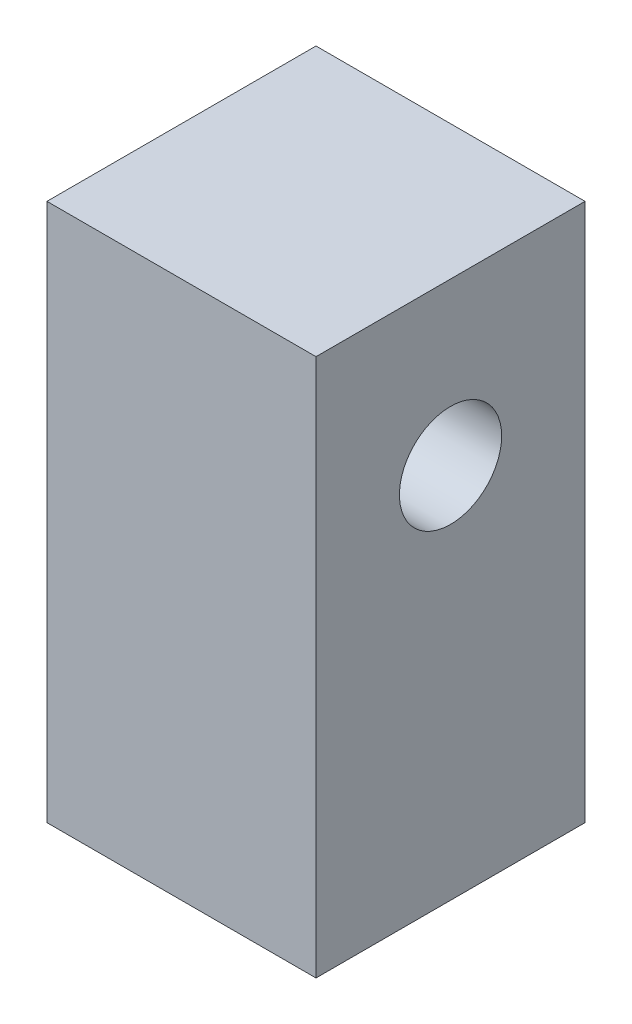
ISO-10303-21;
HEADER;
FILE_DESCRIPTION(('STEP AP214'),'2;1');
FILE_NAME('part.step','',(''),(''),'','','');
FILE_SCHEMA(('AUTOMOTIVE_DESIGN { 1 0 10303 214 1 1 1 1 }'));
ENDSEC;
DATA;
#1=APPLICATION_CONTEXT('core data for automotive mechanical design processes');
#2=APPLICATION_PROTOCOL_DEFINITION('international standard','automotive_design',2000,#1);
#3=PRODUCT_CONTEXT('',#1,'mechanical');
#4=PRODUCT('Part','Part','',(#3));
#5=PRODUCT_RELATED_PRODUCT_CATEGORY('part','',(#4));
#6=PRODUCT_DEFINITION_FORMATION('','',#4);
#7=PRODUCT_DEFINITION_CONTEXT('part definition',#1,'design');
#8=PRODUCT_DEFINITION('design','',#6,#7);
#9=PRODUCT_DEFINITION_SHAPE('','',#8);
#10=(LENGTH_UNIT() NAMED_UNIT(*) SI_UNIT(.MILLI.,.METRE.));
#11=(NAMED_UNIT(*) PLANE_ANGLE_UNIT() SI_UNIT($,.RADIAN.));
#12=(NAMED_UNIT(*) SI_UNIT($,.STERADIAN.) SOLID_ANGLE_UNIT());
#13=UNCERTAINTY_MEASURE_WITH_UNIT(LENGTH_MEASURE(1.E-05),#10,'distance_accuracy_value','');
#14=(GEOMETRIC_REPRESENTATION_CONTEXT(3) GLOBAL_UNCERTAINTY_ASSIGNED_CONTEXT((#13)) GLOBAL_UNIT_ASSIGNED_CONTEXT((#10,
#11,#12)) REPRESENTATION_CONTEXT('',''));
#15=CARTESIAN_POINT('',(0.,0.,0.));
#16=DIRECTION('',(0.,0.,1.));
#17=DIRECTION('',(1.,0.,0.));
#18=AXIS2_PLACEMENT_3D('',#15,#16,#17);
#19=CARTESIAN_POINT('',(-6.35,25.4,6.35));
#20=DIRECTION('',(1.,0.,0.));
#21=DIRECTION('',(0.,0.,-1.));
#22=AXIS2_PLACEMENT_3D('',#19,#20,#21);
#23=PLANE('',#22);
#24=CARTESIAN_POINT('',(-6.35,17.78,0.));
#25=DIRECTION('',(1.,0.,0.));
#26=DIRECTION('',(0.,0.,-1.));
#27=AXIS2_PLACEMENT_3D('',#24,#25,#26);
#28=CIRCLE('',#27,2.413);
#29=CARTESIAN_POINT('',(-6.35,17.78,-2.413));
#30=VERTEX_POINT('',#29);
#31=EDGE_CURVE('E107',#30,#30,#28,.T.);
#32=ORIENTED_EDGE('',*,*,#31,.T.);
#33=EDGE_LOOP('',(#32));
#34=FACE_BOUND('',#33,.T.);
#35=DIRECTION('',(0.,0.,1.));
#36=VECTOR('',#35,1.);
#37=CARTESIAN_POINT('',(-6.35,0.,6.35));
#38=LINE('',#37,#36);
#39=CARTESIAN_POINT('',(-6.35,0.,-6.35));
#40=VERTEX_POINT('',#39);
#41=CARTESIAN_POINT('',(-6.35,0.,6.35));
#42=VERTEX_POINT('',#41);
#43=EDGE_CURVE('E104',#40,#42,#38,.T.);
#44=ORIENTED_EDGE('',*,*,#43,.T.);
#45=DIRECTION('',(0.,-1.,0.));
#46=VECTOR('',#45,1.);
#47=CARTESIAN_POINT('',(-6.35,25.4,6.35));
#48=LINE('',#47,#46);
#49=CARTESIAN_POINT('',(-6.35,25.4,6.35));
#50=VERTEX_POINT('',#49);
#51=EDGE_CURVE('E11',#50,#42,#48,.T.);
#52=ORIENTED_EDGE('',*,*,#51,.F.);
#53=DIRECTION('',(0.,0.,1.));
#54=VECTOR('',#53,1.);
#55=CARTESIAN_POINT('',(-6.35,25.4,6.35));
#56=LINE('',#55,#54);
#57=CARTESIAN_POINT('',(-6.35,25.4,-6.35));
#58=VERTEX_POINT('',#57);
#59=EDGE_CURVE('E92',#58,#50,#56,.T.);
#60=ORIENTED_EDGE('',*,*,#59,.F.);
#61=DIRECTION('',(0.,-1.,0.));
#62=VECTOR('',#61,1.);
#63=CARTESIAN_POINT('',(-6.35,25.4,-6.35));
#64=LINE('',#63,#62);
#65=EDGE_CURVE('E100',#58,#40,#64,.T.);
#66=ORIENTED_EDGE('',*,*,#65,.T.);
#67=EDGE_LOOP('',(#44,#52,#60,#66));
#68=FACE_BOUND('',#67,.T.);
#69=ADVANCED_FACE('F41',(#34,#68),#23,.F.);
#70=CARTESIAN_POINT('',(6.35,25.4,6.35));
#71=DIRECTION('',(0.,0.,-1.));
#72=DIRECTION('',(-1.,0.,0.));
#73=AXIS2_PLACEMENT_3D('',#70,#71,#72);
#74=PLANE('',#73);
#75=DIRECTION('',(1.,0.,0.));
#76=VECTOR('',#75,1.);
#77=CARTESIAN_POINT('',(6.35,0.,6.35));
#78=LINE('',#77,#76);
#79=CARTESIAN_POINT('',(6.35,0.,6.35));
#80=VERTEX_POINT('',#79);
#81=EDGE_CURVE('E96',#42,#80,#78,.T.);
#82=ORIENTED_EDGE('',*,*,#81,.T.);
#83=DIRECTION('',(0.,-1.,0.));
#84=VECTOR('',#83,1.);
#85=CARTESIAN_POINT('',(6.35,25.4,6.35));
#86=LINE('',#85,#84);
#87=CARTESIAN_POINT('',(6.35,25.4,6.35));
#88=VERTEX_POINT('',#87);
#89=EDGE_CURVE('E49',#88,#80,#86,.T.);
#90=ORIENTED_EDGE('',*,*,#89,.F.);
#91=DIRECTION('',(1.,0.,0.));
#92=VECTOR('',#91,1.);
#93=CARTESIAN_POINT('',(6.35,25.4,6.35));
#94=LINE('',#93,#92);
#95=EDGE_CURVE('E87',#50,#88,#94,.T.);
#96=ORIENTED_EDGE('',*,*,#95,.F.);
#97=ORIENTED_EDGE('',*,*,#51,.T.);
#98=EDGE_LOOP('',(#82,#90,#96,#97));
#99=FACE_BOUND('',#98,.T.);
#100=ADVANCED_FACE('F95',(#99),#74,.F.);
#101=CARTESIAN_POINT('',(6.35,25.4,6.35));
#102=DIRECTION('',(-1.,0.,0.));
#103=DIRECTION('',(0.,0.,1.));
#104=AXIS2_PLACEMENT_3D('',#101,#102,#103);
#105=PLANE('',#104);
#106=CARTESIAN_POINT('',(6.35,17.78,0.));
#107=DIRECTION('',(1.,0.,0.));
#108=DIRECTION('',(0.,0.,-1.));
#109=AXIS2_PLACEMENT_3D('',#106,#107,#108);
#110=CIRCLE('',#109,2.413);
#111=CARTESIAN_POINT('',(6.35,17.78,-2.413));
#112=VERTEX_POINT('',#111);
#113=EDGE_CURVE('E120',#112,#112,#110,.T.);
#114=ORIENTED_EDGE('',*,*,#113,.F.);
#115=EDGE_LOOP('',(#114));
#116=FACE_BOUND('',#115,.T.);
#117=DIRECTION('',(0.,0.,-1.));
#118=VECTOR('',#117,1.);
#119=CARTESIAN_POINT('',(6.35,0.,6.35));
#120=LINE('',#119,#118);
#121=CARTESIAN_POINT('',(6.35,0.,-6.35));
#122=VERTEX_POINT('',#121);
#123=EDGE_CURVE('E74',#80,#122,#120,.T.);
#124=ORIENTED_EDGE('',*,*,#123,.T.);
#125=DIRECTION('',(0.,-1.,0.));
#126=VECTOR('',#125,1.);
#127=CARTESIAN_POINT('',(6.35,25.4,-6.35));
#128=LINE('',#127,#126);
#129=CARTESIAN_POINT('',(6.35,25.4,-6.35));
#130=VERTEX_POINT('',#129);
#131=EDGE_CURVE('E97',#130,#122,#128,.T.);
#132=ORIENTED_EDGE('',*,*,#131,.F.);
#133=DIRECTION('',(0.,0.,-1.));
#134=VECTOR('',#133,1.);
#135=CARTESIAN_POINT('',(6.35,25.4,6.35));
#136=LINE('',#135,#134);
#137=EDGE_CURVE('E90',#88,#130,#136,.T.);
#138=ORIENTED_EDGE('',*,*,#137,.F.);
#139=ORIENTED_EDGE('',*,*,#89,.T.);
#140=EDGE_LOOP('',(#124,#132,#138,#139));
#141=FACE_BOUND('',#140,.T.);
#142=ADVANCED_FACE('F98',(#116,#141),#105,.F.);
#143=CARTESIAN_POINT('',(6.35,25.4,-6.35));
#144=DIRECTION('',(0.,0.,1.));
#145=DIRECTION('',(1.,0.,0.));
#146=AXIS2_PLACEMENT_3D('',#143,#144,#145);
#147=PLANE('',#146);
#148=DIRECTION('',(-1.,0.,0.));
#149=VECTOR('',#148,1.);
#150=CARTESIAN_POINT('',(6.35,0.,-6.35));
#151=LINE('',#150,#149);
#152=EDGE_CURVE('E80',#122,#40,#151,.T.);
#153=ORIENTED_EDGE('',*,*,#152,.T.);
#154=ORIENTED_EDGE('',*,*,#65,.F.);
#155=DIRECTION('',(-1.,0.,0.));
#156=VECTOR('',#155,1.);
#157=CARTESIAN_POINT('',(6.35,25.4,-6.35));
#158=LINE('',#157,#156);
#159=EDGE_CURVE('E57',#130,#58,#158,.T.);
#160=ORIENTED_EDGE('',*,*,#159,.F.);
#161=ORIENTED_EDGE('',*,*,#131,.T.);
#162=EDGE_LOOP('',(#153,#154,#160,#161));
#163=FACE_BOUND('',#162,.T.);
#164=ADVANCED_FACE('F112',(#163),#147,.F.);
#165=CARTESIAN_POINT('',(0.,25.4,0.));
#166=DIRECTION('',(0.,1.,0.));
#167=DIRECTION('',(0.,0.,1.));
#168=AXIS2_PLACEMENT_3D('',#165,#166,#167);
#169=PLANE('',#168);
#170=ORIENTED_EDGE('',*,*,#59,.T.);
#171=ORIENTED_EDGE('',*,*,#95,.T.);
#172=ORIENTED_EDGE('',*,*,#137,.T.);
#173=ORIENTED_EDGE('',*,*,#159,.T.);
#174=EDGE_LOOP('',(#170,#171,#172,#173));
#175=FACE_BOUND('',#174,.T.);
#176=ADVANCED_FACE('F88',(#175),#169,.T.);
#177=CARTESIAN_POINT('',(0.,0.,0.));
#178=DIRECTION('',(0.,1.,0.));
#179=DIRECTION('',(0.,0.,1.));
#180=AXIS2_PLACEMENT_3D('',#177,#178,#179);
#181=PLANE('',#180);
#182=ORIENTED_EDGE('',*,*,#43,.F.);
#183=ORIENTED_EDGE('',*,*,#152,.F.);
#184=ORIENTED_EDGE('',*,*,#123,.F.);
#185=ORIENTED_EDGE('',*,*,#81,.F.);
#186=EDGE_LOOP('',(#182,#183,#184,#185));
#187=FACE_BOUND('',#186,.T.);
#188=ADVANCED_FACE('F115',(#187),#181,.F.);
#189=CARTESIAN_POINT('',(-19.05,17.78,0.));
#190=DIRECTION('',(1.,0.,0.));
#191=DIRECTION('',(0.,0.,-1.));
#192=AXIS2_PLACEMENT_3D('',#189,#190,#191);
#193=CYLINDRICAL_SURFACE('',#192,2.413);
#194=ORIENTED_EDGE('',*,*,#113,.T.);
#195=EDGE_LOOP('',(#194));
#196=FACE_BOUND('',#195,.T.);
#197=ORIENTED_EDGE('',*,*,#31,.F.);
#198=EDGE_LOOP('',(#197));
#199=FACE_BOUND('',#198,.T.);
#200=ADVANCED_FACE('F124',(#196,#199),#193,.F.);
#201=CLOSED_SHELL('',(#69,#100,#142,#164,#176,#188,#200));
#202=MANIFOLD_SOLID_BREP('B2',#201);
#203=ADVANCED_BREP_SHAPE_REPRESENTATION('',(#18,#202),#14);
#204=SHAPE_DEFINITION_REPRESENTATION(#9,#203);
ENDSEC;
END-ISO-10303-21;
